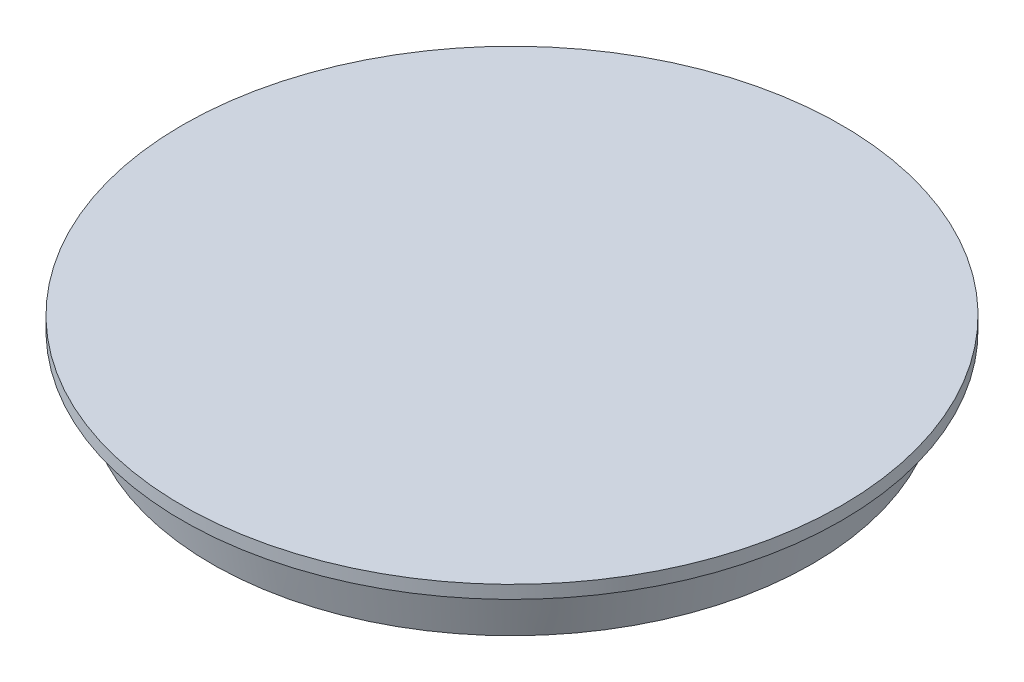
ISO-10303-21;
HEADER;
FILE_DESCRIPTION(('STEP AP214'),'2;1');
FILE_NAME('part.step','',(''),(''),'','','');
FILE_SCHEMA(('AUTOMOTIVE_DESIGN { 1 0 10303 214 1 1 1 1 }'));
ENDSEC;
DATA;
#1=APPLICATION_CONTEXT('core data for automotive mechanical design processes');
#2=APPLICATION_PROTOCOL_DEFINITION('international standard','automotive_design',2000,#1);
#3=PRODUCT_CONTEXT('',#1,'mechanical');
#4=PRODUCT('Part','Part','',(#3));
#5=PRODUCT_RELATED_PRODUCT_CATEGORY('part','',(#4));
#6=PRODUCT_DEFINITION_FORMATION('','',#4);
#7=PRODUCT_DEFINITION_CONTEXT('part definition',#1,'design');
#8=PRODUCT_DEFINITION('design','',#6,#7);
#9=PRODUCT_DEFINITION_SHAPE('','',#8);
#10=(LENGTH_UNIT() NAMED_UNIT(*) SI_UNIT(.MILLI.,.METRE.));
#11=(NAMED_UNIT(*) PLANE_ANGLE_UNIT() SI_UNIT($,.RADIAN.));
#12=(NAMED_UNIT(*) SI_UNIT($,.STERADIAN.) SOLID_ANGLE_UNIT());
#13=UNCERTAINTY_MEASURE_WITH_UNIT(LENGTH_MEASURE(1.E-05),#10,'distance_accuracy_value','');
#14=(GEOMETRIC_REPRESENTATION_CONTEXT(3) GLOBAL_UNCERTAINTY_ASSIGNED_CONTEXT((#13)) GLOBAL_UNIT_ASSIGNED_CONTEXT((#10,
#11,#12)) REPRESENTATION_CONTEXT('',''));
#15=CARTESIAN_POINT('',(0.,0.,0.));
#16=DIRECTION('',(0.,0.,1.));
#17=DIRECTION('',(1.,0.,0.));
#18=AXIS2_PLACEMENT_3D('',#15,#16,#17);
#19=CARTESIAN_POINT('',(0.,0.,0.));
#20=DIRECTION('',(0.,1.,0.));
#21=DIRECTION('',(-1.,0.,0.));
#22=AXIS2_PLACEMENT_3D('',#19,#20,#21);
#23=PLANE('',#22);
#24=CARTESIAN_POINT('',(0.,0.,0.));
#25=DIRECTION('',(0.,-1.,0.));
#26=DIRECTION('',(1.,0.,0.));
#27=AXIS2_PLACEMENT_3D('',#24,#25,#26);
#28=CIRCLE('',#27,25.25);
#29=CARTESIAN_POINT('',(25.25,0.,0.));
#30=VERTEX_POINT('',#29);
#31=EDGE_CURVE('E38',#30,#30,#28,.T.);
#32=ORIENTED_EDGE('',*,*,#31,.F.);
#33=EDGE_LOOP('',(#32));
#34=FACE_BOUND('',#33,.T.);
#35=ADVANCED_FACE('F31',(#34),#23,.T.);
#36=CARTESIAN_POINT('',(0.,-1.,0.));
#37=DIRECTION('',(0.,-1.,0.));
#38=DIRECTION('',(1.,0.,0.));
#39=AXIS2_PLACEMENT_3D('',#36,#37,#38);
#40=CYLINDRICAL_SURFACE('',#39,25.25);
#41=ORIENTED_EDGE('',*,*,#31,.T.);
#42=EDGE_LOOP('',(#41));
#43=FACE_BOUND('',#42,.T.);
#44=CARTESIAN_POINT('',(0.,-0.999999999999998,0.));
#45=DIRECTION('',(0.,-1.,0.));
#46=DIRECTION('',(1.,0.,0.));
#47=AXIS2_PLACEMENT_3D('',#44,#45,#46);
#48=CIRCLE('',#47,25.25);
#49=CARTESIAN_POINT('',(25.25,-0.999999999999995,0.));
#50=VERTEX_POINT('',#49);
#51=EDGE_CURVE('E42',#50,#50,#48,.T.);
#52=ORIENTED_EDGE('',*,*,#51,.F.);
#53=EDGE_LOOP('',(#52));
#54=FACE_BOUND('',#53,.T.);
#55=ADVANCED_FACE('F75',(#43,#54),#40,.T.);
#56=CARTESIAN_POINT('',(25.25,-0.999999999999995,0.));
#57=DIRECTION('',(0.,-1.,0.));
#58=DIRECTION('',(1.,0.,0.));
#59=AXIS2_PLACEMENT_3D('',#56,#57,#58);
#60=PLANE('',#59);
#61=ORIENTED_EDGE('',*,*,#51,.T.);
#62=EDGE_LOOP('',(#61));
#63=FACE_BOUND('',#62,.T.);
#64=CARTESIAN_POINT('',(0.,-0.999999999999998,0.));
#65=DIRECTION('',(0.,-1.,0.));
#66=DIRECTION('',(1.,0.,0.));
#67=AXIS2_PLACEMENT_3D('',#64,#65,#66);
#68=CIRCLE('',#67,23.75);
#69=CARTESIAN_POINT('',(23.75,-0.999999999999995,0.));
#70=VERTEX_POINT('',#69);
#71=EDGE_CURVE('E46',#70,#70,#68,.T.);
#72=ORIENTED_EDGE('',*,*,#71,.F.);
#73=EDGE_LOOP('',(#72));
#74=FACE_BOUND('',#73,.T.);
#75=ADVANCED_FACE('F71',(#63,#74),#60,.T.);
#76=CARTESIAN_POINT('',(0.,-4.99999999999999,0.));
#77=DIRECTION('',(0.,1.,0.));
#78=DIRECTION('',(-1.,0.,0.));
#79=AXIS2_PLACEMENT_3D('',#76,#77,#78);
#80=CONICAL_SURFACE('',#79,23.,0.185347949995693);
#81=ORIENTED_EDGE('',*,*,#71,.T.);
#82=EDGE_LOOP('',(#81));
#83=FACE_BOUND('',#82,.T.);
#84=CARTESIAN_POINT('',(0.,-4.99999999999999,0.));
#85=DIRECTION('',(0.,-1.,0.));
#86=DIRECTION('',(1.,0.,0.));
#87=AXIS2_PLACEMENT_3D('',#84,#85,#86);
#88=CIRCLE('',#87,23.);
#89=CARTESIAN_POINT('',(23.,-4.99999999999999,0.));
#90=VERTEX_POINT('',#89);
#91=EDGE_CURVE('E51',#90,#90,#88,.T.);
#92=ORIENTED_EDGE('',*,*,#91,.F.);
#93=EDGE_LOOP('',(#92));
#94=FACE_BOUND('',#93,.T.);
#95=ADVANCED_FACE('F63',(#83,#94),#80,.T.);
#96=CARTESIAN_POINT('',(23.,-4.99999999999999,0.));
#97=DIRECTION('',(0.,-1.,0.));
#98=DIRECTION('',(1.,0.,0.));
#99=AXIS2_PLACEMENT_3D('',#96,#97,#98);
#100=PLANE('',#99);
#101=ORIENTED_EDGE('',*,*,#91,.T.);
#102=EDGE_LOOP('',(#101));
#103=FACE_BOUND('',#102,.T.);
#104=CARTESIAN_POINT('',(0.,-5.,0.));
#105=DIRECTION('',(0.,-1.,0.));
#106=DIRECTION('',(1.,0.,0.));
#107=AXIS2_PLACEMENT_3D('',#104,#105,#106);
#108=CIRCLE('',#107,22.);
#109=CARTESIAN_POINT('',(22.,-5.,0.));
#110=VERTEX_POINT('',#109);
#111=EDGE_CURVE('E54',#110,#110,#108,.T.);
#112=ORIENTED_EDGE('',*,*,#111,.F.);
#113=EDGE_LOOP('',(#112));
#114=FACE_BOUND('',#113,.T.);
#115=ADVANCED_FACE('F60',(#103,#114),#100,.T.);
#116=CARTESIAN_POINT('',(0.,-1.,0.));
#117=DIRECTION('',(0.,-1.,0.));
#118=DIRECTION('',(1.,0.,0.));
#119=AXIS2_PLACEMENT_3D('',#116,#117,#118);
#120=PLANE('',#119);
#121=CARTESIAN_POINT('',(0.,-1.,0.));
#122=DIRECTION('',(0.,-1.,0.));
#123=DIRECTION('',(1.,0.,0.));
#124=AXIS2_PLACEMENT_3D('',#121,#122,#123);
#125=CIRCLE('',#124,18.);
#126=CARTESIAN_POINT('',(18.,-1.,0.));
#127=VERTEX_POINT('',#126);
#128=EDGE_CURVE('E10',#127,#127,#125,.T.);
#129=ORIENTED_EDGE('',*,*,#128,.T.);
#130=EDGE_LOOP('',(#129));
#131=FACE_BOUND('',#130,.T.);
#132=ADVANCED_FACE('F62',(#131),#120,.T.);
#133=CARTESIAN_POINT('',(0.,-5.,0.));
#134=DIRECTION('',(0.,-1.,0.));
#135=DIRECTION('',(1.,0.,0.));
#136=AXIS2_PLACEMENT_3D('',#133,#134,#135);
#137=TOROIDAL_SURFACE('',#136,18.,4.);
#138=ORIENTED_EDGE('',*,*,#111,.T.);
#139=EDGE_LOOP('',(#138));
#140=FACE_BOUND('',#139,.T.);
#141=ORIENTED_EDGE('',*,*,#128,.F.);
#142=EDGE_LOOP('',(#141));
#143=FACE_BOUND('',#142,.T.);
#144=ADVANCED_FACE('F33',(#140,#143),#137,.F.);
#145=CLOSED_SHELL('',(#35,#55,#75,#95,#115,#132,#144));
#146=MANIFOLD_SOLID_BREP('B2',#145);
#147=ADVANCED_BREP_SHAPE_REPRESENTATION('',(#18,#146),#14);
#148=SHAPE_DEFINITION_REPRESENTATION(#9,#147);
ENDSEC;
END-ISO-10303-21;
